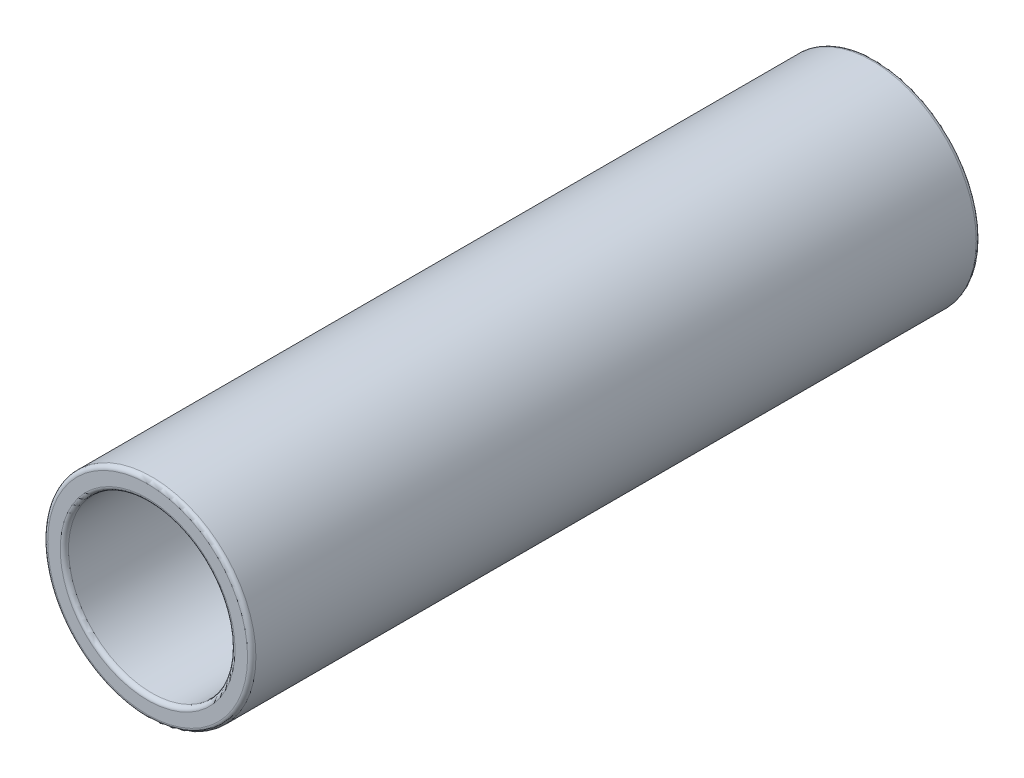
ISO-10303-21;
HEADER;
FILE_DESCRIPTION(('STEP AP214'),'2;1');
FILE_NAME('part.step','',(''),(''),'','','');
FILE_SCHEMA(('AUTOMOTIVE_DESIGN { 1 0 10303 214 1 1 1 1 }'));
ENDSEC;
DATA;
#1=APPLICATION_CONTEXT('core data for automotive mechanical design processes');
#2=APPLICATION_PROTOCOL_DEFINITION('international standard','automotive_design',2000,#1);
#3=PRODUCT_CONTEXT('',#1,'mechanical');
#4=PRODUCT('Part','Part','',(#3));
#5=PRODUCT_RELATED_PRODUCT_CATEGORY('part','',(#4));
#6=PRODUCT_DEFINITION_FORMATION('','',#4);
#7=PRODUCT_DEFINITION_CONTEXT('part definition',#1,'design');
#8=PRODUCT_DEFINITION('design','',#6,#7);
#9=PRODUCT_DEFINITION_SHAPE('','',#8);
#10=(LENGTH_UNIT() NAMED_UNIT(*) SI_UNIT(.MILLI.,.METRE.));
#11=(NAMED_UNIT(*) PLANE_ANGLE_UNIT() SI_UNIT($,.RADIAN.));
#12=(NAMED_UNIT(*) SI_UNIT($,.STERADIAN.) SOLID_ANGLE_UNIT());
#13=UNCERTAINTY_MEASURE_WITH_UNIT(LENGTH_MEASURE(1.E-05),#10,'distance_accuracy_value','');
#14=(GEOMETRIC_REPRESENTATION_CONTEXT(3) GLOBAL_UNCERTAINTY_ASSIGNED_CONTEXT((#13)) GLOBAL_UNIT_ASSIGNED_CONTEXT((#10,
#11,#12)) REPRESENTATION_CONTEXT('',''));
#15=CARTESIAN_POINT('',(0.,0.,0.));
#16=DIRECTION('',(0.,0.,1.));
#17=DIRECTION('',(1.,0.,0.));
#18=AXIS2_PLACEMENT_3D('',#15,#16,#17);
#19=CARTESIAN_POINT('',(0.,0.,35.));
#20=DIRECTION('',(0.,0.,1.));
#21=DIRECTION('',(1.,0.,0.));
#22=AXIS2_PLACEMENT_3D('',#19,#20,#21);
#23=PLANE('',#22);
#24=CARTESIAN_POINT('',(0.,0.,35.));
#25=DIRECTION('',(0.,0.,1.));
#26=DIRECTION('',(1.,0.,0.));
#27=AXIS2_PLACEMENT_3D('',#24,#25,#26);
#28=CIRCLE('',#27,4.2);
#29=CARTESIAN_POINT('',(4.2,0.,35.));
#30=VERTEX_POINT('',#29);
#31=EDGE_CURVE('E10',#30,#30,#28,.F.);
#32=ORIENTED_EDGE('',*,*,#31,.T.);
#33=EDGE_LOOP('',(#32));
#34=FACE_BOUND('',#33,.T.);
#35=CARTESIAN_POINT('',(0.,0.,35.));
#36=DIRECTION('',(0.,0.,1.));
#37=DIRECTION('',(1.,0.,0.));
#38=AXIS2_PLACEMENT_3D('',#35,#36,#37);
#39=CIRCLE('',#38,4.8);
#40=CARTESIAN_POINT('',(4.8,0.,35.));
#41=VERTEX_POINT('',#40);
#42=EDGE_CURVE('E52',#41,#41,#39,.T.);
#43=ORIENTED_EDGE('',*,*,#42,.T.);
#44=EDGE_LOOP('',(#43));
#45=FACE_BOUND('',#44,.T.);
#46=ADVANCED_FACE('F45',(#34,#45),#23,.T.);
#47=CARTESIAN_POINT('',(0.,0.,0.));
#48=DIRECTION('',(0.,0.,1.));
#49=DIRECTION('',(1.,0.,0.));
#50=AXIS2_PLACEMENT_3D('',#47,#48,#49);
#51=PLANE('',#50);
#52=CARTESIAN_POINT('',(0.,0.,0.));
#53=DIRECTION('',(0.,0.,1.));
#54=DIRECTION('',(1.,0.,0.));
#55=AXIS2_PLACEMENT_3D('',#52,#53,#54);
#56=CIRCLE('',#55,4.2);
#57=CARTESIAN_POINT('',(4.2,0.,0.));
#58=VERTEX_POINT('',#57);
#59=EDGE_CURVE('E71',#58,#58,#56,.T.);
#60=ORIENTED_EDGE('',*,*,#59,.T.);
#61=EDGE_LOOP('',(#60));
#62=FACE_BOUND('',#61,.T.);
#63=CARTESIAN_POINT('',(0.,0.,0.));
#64=DIRECTION('',(0.,0.,1.));
#65=DIRECTION('',(1.,0.,0.));
#66=AXIS2_PLACEMENT_3D('',#63,#64,#65);
#67=CIRCLE('',#66,4.8);
#68=CARTESIAN_POINT('',(4.8,0.,0.));
#69=VERTEX_POINT('',#68);
#70=EDGE_CURVE('E74',#69,#69,#67,.F.);
#71=ORIENTED_EDGE('',*,*,#70,.T.);
#72=EDGE_LOOP('',(#71));
#73=FACE_BOUND('',#72,.T.);
#74=ADVANCED_FACE('F78',(#62,#73),#51,.F.);
#75=CARTESIAN_POINT('',(0.,0.,35.));
#76=DIRECTION('',(0.,0.,-1.));
#77=DIRECTION('',(-1.,0.,0.));
#78=AXIS2_PLACEMENT_3D('',#75,#76,#77);
#79=CYLINDRICAL_SURFACE('',#78,5.);
#80=CARTESIAN_POINT('',(0.,0.,0.199999999999999));
#81=DIRECTION('',(0.,0.,1.));
#82=DIRECTION('',(1.,0.,0.));
#83=AXIS2_PLACEMENT_3D('',#80,#81,#82);
#84=CIRCLE('',#83,5.);
#85=CARTESIAN_POINT('',(5.,0.,0.199999999999999));
#86=VERTEX_POINT('',#85);
#87=EDGE_CURVE('E56',#86,#86,#84,.T.);
#88=ORIENTED_EDGE('',*,*,#87,.T.);
#89=EDGE_LOOP('',(#88));
#90=FACE_BOUND('',#89,.T.);
#91=CARTESIAN_POINT('',(0.,0.,34.8));
#92=DIRECTION('',(0.,0.,1.));
#93=DIRECTION('',(1.,0.,0.));
#94=AXIS2_PLACEMENT_3D('',#91,#92,#93);
#95=CIRCLE('',#94,5.);
#96=CARTESIAN_POINT('',(5.,0.,34.8));
#97=VERTEX_POINT('',#96);
#98=EDGE_CURVE('E60',#97,#97,#95,.F.);
#99=ORIENTED_EDGE('',*,*,#98,.T.);
#100=EDGE_LOOP('',(#99));
#101=FACE_BOUND('',#100,.T.);
#102=ADVANCED_FACE('F88',(#90,#101),#79,.T.);
#103=CARTESIAN_POINT('',(0.,0.,35.));
#104=DIRECTION('',(0.,0.,-1.));
#105=DIRECTION('',(-1.,0.,0.));
#106=AXIS2_PLACEMENT_3D('',#103,#104,#105);
#107=CYLINDRICAL_SURFACE('',#106,4.);
#108=CARTESIAN_POINT('',(0.,0.,0.199999999999999));
#109=DIRECTION('',(0.,0.,1.));
#110=DIRECTION('',(1.,0.,0.));
#111=AXIS2_PLACEMENT_3D('',#108,#109,#110);
#112=CIRCLE('',#111,4.);
#113=CARTESIAN_POINT('',(4.,0.,0.199999999999999));
#114=VERTEX_POINT('',#113);
#115=EDGE_CURVE('E65',#114,#114,#112,.F.);
#116=ORIENTED_EDGE('',*,*,#115,.T.);
#117=EDGE_LOOP('',(#116));
#118=FACE_BOUND('',#117,.T.);
#119=CARTESIAN_POINT('',(0.,0.,34.8));
#120=DIRECTION('',(0.,0.,1.));
#121=DIRECTION('',(1.,0.,0.));
#122=AXIS2_PLACEMENT_3D('',#119,#120,#121);
#123=CIRCLE('',#122,4.);
#124=CARTESIAN_POINT('',(4.,0.,34.8));
#125=VERTEX_POINT('',#124);
#126=EDGE_CURVE('E68',#125,#125,#123,.T.);
#127=ORIENTED_EDGE('',*,*,#126,.T.);
#128=EDGE_LOOP('',(#127));
#129=FACE_BOUND('',#128,.T.);
#130=ADVANCED_FACE('F91',(#118,#129),#107,.F.);
#131=CARTESIAN_POINT('',(0.,0.,0.199999999999999));
#132=DIRECTION('',(0.,0.,1.));
#133=DIRECTION('',(1.,0.,0.));
#134=AXIS2_PLACEMENT_3D('',#131,#132,#133);
#135=TOROIDAL_SURFACE('',#134,4.2,0.2);
#136=ORIENTED_EDGE('',*,*,#115,.F.);
#137=EDGE_LOOP('',(#136));
#138=FACE_BOUND('',#137,.T.);
#139=ORIENTED_EDGE('',*,*,#59,.F.);
#140=EDGE_LOOP('',(#139));
#141=FACE_BOUND('',#140,.T.);
#142=ADVANCED_FACE('F84',(#138,#141),#135,.T.);
#143=CARTESIAN_POINT('',(0.,0.,0.199999999999999));
#144=DIRECTION('',(0.,0.,1.));
#145=DIRECTION('',(1.,0.,0.));
#146=AXIS2_PLACEMENT_3D('',#143,#144,#145);
#147=TOROIDAL_SURFACE('',#146,4.8,0.2);
#148=ORIENTED_EDGE('',*,*,#70,.F.);
#149=EDGE_LOOP('',(#148));
#150=FACE_BOUND('',#149,.T.);
#151=ORIENTED_EDGE('',*,*,#87,.F.);
#152=EDGE_LOOP('',(#151));
#153=FACE_BOUND('',#152,.T.);
#154=ADVANCED_FACE('F80',(#150,#153),#147,.T.);
#155=CARTESIAN_POINT('',(0.,0.,34.8));
#156=DIRECTION('',(0.,0.,1.));
#157=DIRECTION('',(1.,0.,0.));
#158=AXIS2_PLACEMENT_3D('',#155,#156,#157);
#159=TOROIDAL_SURFACE('',#158,4.2,0.2);
#160=ORIENTED_EDGE('',*,*,#31,.F.);
#161=EDGE_LOOP('',(#160));
#162=FACE_BOUND('',#161,.T.);
#163=ORIENTED_EDGE('',*,*,#126,.F.);
#164=EDGE_LOOP('',(#163));
#165=FACE_BOUND('',#164,.T.);
#166=ADVANCED_FACE('F83',(#162,#165),#159,.T.);
#167=CARTESIAN_POINT('',(0.,0.,34.8));
#168=DIRECTION('',(0.,0.,1.));
#169=DIRECTION('',(1.,0.,0.));
#170=AXIS2_PLACEMENT_3D('',#167,#168,#169);
#171=TOROIDAL_SURFACE('',#170,4.8,0.2);
#172=ORIENTED_EDGE('',*,*,#98,.F.);
#173=EDGE_LOOP('',(#172));
#174=FACE_BOUND('',#173,.T.);
#175=ORIENTED_EDGE('',*,*,#42,.F.);
#176=EDGE_LOOP('',(#175));
#177=FACE_BOUND('',#176,.T.);
#178=ADVANCED_FACE('F47',(#174,#177),#171,.T.);
#179=CLOSED_SHELL('',(#46,#74,#102,#130,#142,#154,#166,#178));
#180=MANIFOLD_SOLID_BREP('B2',#179);
#181=ADVANCED_BREP_SHAPE_REPRESENTATION('',(#18,#180),#14);
#182=SHAPE_DEFINITION_REPRESENTATION(#9,#181);
ENDSEC;
END-ISO-10303-21;
